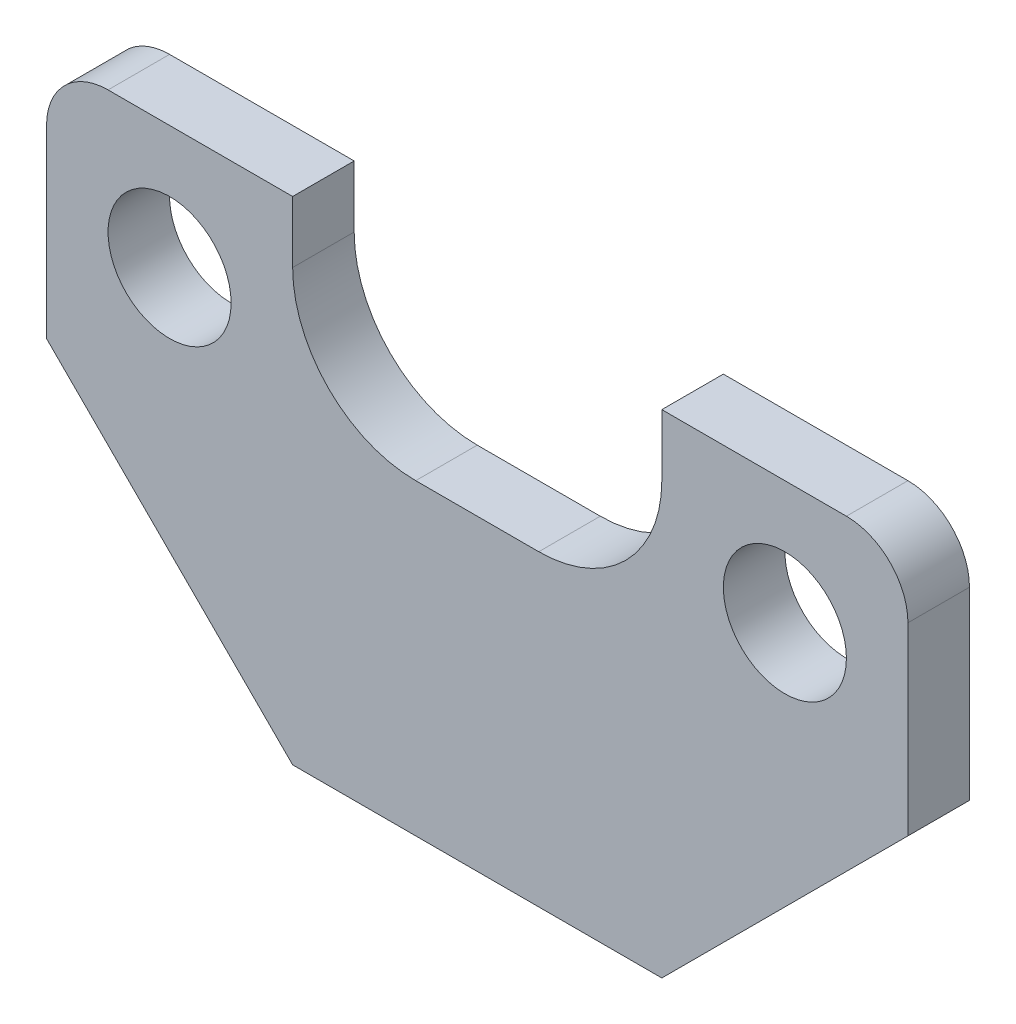
ISO-10303-21;
HEADER;
FILE_DESCRIPTION(('STEP AP214'),'2;1');
FILE_NAME('part.step','',(''),(''),'','','');
FILE_SCHEMA(('AUTOMOTIVE_DESIGN { 1 0 10303 214 1 1 1 1 }'));
ENDSEC;
DATA;
#1=APPLICATION_CONTEXT('core data for automotive mechanical design processes');
#2=APPLICATION_PROTOCOL_DEFINITION('international standard','automotive_design',2000,#1);
#3=PRODUCT_CONTEXT('',#1,'mechanical');
#4=PRODUCT('Part','Part','',(#3));
#5=PRODUCT_RELATED_PRODUCT_CATEGORY('part','',(#4));
#6=PRODUCT_DEFINITION_FORMATION('','',#4);
#7=PRODUCT_DEFINITION_CONTEXT('part definition',#1,'design');
#8=PRODUCT_DEFINITION('design','',#6,#7);
#9=PRODUCT_DEFINITION_SHAPE('','',#8);
#10=(LENGTH_UNIT() NAMED_UNIT(*) SI_UNIT(.MILLI.,.METRE.));
#11=(NAMED_UNIT(*) PLANE_ANGLE_UNIT() SI_UNIT($,.RADIAN.));
#12=(NAMED_UNIT(*) SI_UNIT($,.STERADIAN.) SOLID_ANGLE_UNIT());
#13=UNCERTAINTY_MEASURE_WITH_UNIT(LENGTH_MEASURE(1.E-05),#10,'distance_accuracy_value','');
#14=(GEOMETRIC_REPRESENTATION_CONTEXT(3) GLOBAL_UNCERTAINTY_ASSIGNED_CONTEXT((#13)) GLOBAL_UNIT_ASSIGNED_CONTEXT((#10,
#11,#12)) REPRESENTATION_CONTEXT('',''));
#15=CARTESIAN_POINT('',(0.,0.,0.));
#16=DIRECTION('',(0.,0.,1.));
#17=DIRECTION('',(1.,0.,0.));
#18=AXIS2_PLACEMENT_3D('',#15,#16,#17);
#19=CARTESIAN_POINT('',(6.00237949679068,11.8729903536978,5.));
#20=DIRECTION('',(0.,0.,1.));
#21=DIRECTION('',(1.,0.,0.));
#22=AXIS2_PLACEMENT_3D('',#19,#20,#21);
#23=PLANE('',#22);
#24=CARTESIAN_POINT('',(-23.9976205032093,6.87299035369775,5.));
#25=DIRECTION('',(0.,0.,1.));
#26=DIRECTION('',(1.,0.,0.));
#27=AXIS2_PLACEMENT_3D('',#24,#25,#26);
#28=CIRCLE('',#27,5.);
#29=CARTESIAN_POINT('',(-18.9976205032093,6.87299035369775,5.));
#30=VERTEX_POINT('',#29);
#31=EDGE_CURVE('E174',#30,#30,#28,.T.);
#32=ORIENTED_EDGE('',*,*,#31,.F.);
#33=EDGE_LOOP('',(#32));
#34=FACE_BOUND('',#33,.T.);
#35=CARTESIAN_POINT('',(6.00237949679068,11.8729903536978,5.));
#36=DIRECTION('',(0.,0.,-1.));
#37=DIRECTION('',(1.,0.,0.));
#38=AXIS2_PLACEMENT_3D('',#35,#36,#37);
#39=CIRCLE('',#38,10.);
#40=CARTESIAN_POINT('',(16.0023794967907,11.8729903536978,5.));
#41=VERTEX_POINT('',#40);
#42=CARTESIAN_POINT('',(6.00237949679068,1.87299035369776,5.));
#43=VERTEX_POINT('',#42);
#44=EDGE_CURVE('E197',#41,#43,#39,.T.);
#45=ORIENTED_EDGE('',*,*,#44,.T.);
#46=DIRECTION('',(-1.,0.,0.));
#47=VECTOR('',#46,1.);
#48=CARTESIAN_POINT('',(-3.99762050320931,1.87299035369776,5.));
#49=LINE('',#48,#47);
#50=CARTESIAN_POINT('',(-3.99762050320931,1.87299035369776,5.));
#51=VERTEX_POINT('',#50);
#52=EDGE_CURVE('E115',#43,#51,#49,.T.);
#53=ORIENTED_EDGE('',*,*,#52,.T.);
#54=CARTESIAN_POINT('',(-3.99762050320931,11.8729903536978,5.));
#55=DIRECTION('',(0.,0.,-1.));
#56=DIRECTION('',(1.,0.,0.));
#57=AXIS2_PLACEMENT_3D('',#54,#55,#56);
#58=CIRCLE('',#57,10.);
#59=CARTESIAN_POINT('',(-13.9976205032093,11.8729903536978,5.));
#60=VERTEX_POINT('',#59);
#61=EDGE_CURVE('E230',#51,#60,#58,.T.);
#62=ORIENTED_EDGE('',*,*,#61,.T.);
#63=DIRECTION('',(0.,1.,0.));
#64=VECTOR('',#63,1.);
#65=CARTESIAN_POINT('',(-13.9976205032093,16.8729903536978,5.));
#66=LINE('',#65,#64);
#67=CARTESIAN_POINT('',(-13.9976205032093,16.8729903536978,5.));
#68=VERTEX_POINT('',#67);
#69=EDGE_CURVE('E249',#60,#68,#66,.T.);
#70=ORIENTED_EDGE('',*,*,#69,.T.);
#71=DIRECTION('',(-1.,0.,0.));
#72=VECTOR('',#71,1.);
#73=CARTESIAN_POINT('',(-28.9976205032093,16.8729903536978,5.));
#74=LINE('',#73,#72);
#75=CARTESIAN_POINT('',(-28.9976205032093,16.8729903536978,5.));
#76=VERTEX_POINT('',#75);
#77=EDGE_CURVE('E246',#68,#76,#74,.T.);
#78=ORIENTED_EDGE('',*,*,#77,.T.);
#79=CARTESIAN_POINT('',(-28.9976205032093,11.8729903536978,5.));
#80=DIRECTION('',(0.,0.,1.));
#81=DIRECTION('',(1.,0.,0.));
#82=AXIS2_PLACEMENT_3D('',#79,#80,#81);
#83=CIRCLE('',#82,5.);
#84=CARTESIAN_POINT('',(-33.9976205032093,11.8729903536978,5.));
#85=VERTEX_POINT('',#84);
#86=EDGE_CURVE('E248',#76,#85,#83,.T.);
#87=ORIENTED_EDGE('',*,*,#86,.T.);
#88=DIRECTION('',(0.,-1.,0.));
#89=VECTOR('',#88,1.);
#90=CARTESIAN_POINT('',(-33.9976205032093,11.8729903536978,5.));
#91=LINE('',#90,#89);
#92=CARTESIAN_POINT('',(-33.9976205032093,-3.12700964630224,5.));
#93=VERTEX_POINT('',#92);
#94=EDGE_CURVE('E251',#85,#93,#91,.T.);
#95=ORIENTED_EDGE('',*,*,#94,.T.);
#96=DIRECTION('',(0.707106781186548,-0.707106781186548,0.));
#97=VECTOR('',#96,1.);
#98=CARTESIAN_POINT('',(-33.9976205032093,-3.12700964630224,5.));
#99=LINE('',#98,#97);
#100=CARTESIAN_POINT('',(-13.9976205032093,-23.1270096463022,5.));
#101=VERTEX_POINT('',#100);
#102=EDGE_CURVE('E257',#93,#101,#99,.T.);
#103=ORIENTED_EDGE('',*,*,#102,.T.);
#104=DIRECTION('',(1.,0.,0.));
#105=VECTOR('',#104,1.);
#106=CARTESIAN_POINT('',(-13.9976205032093,-23.1270096463022,5.));
#107=LINE('',#106,#105);
#108=CARTESIAN_POINT('',(16.0023794967907,-23.1270096463022,5.));
#109=VERTEX_POINT('',#108);
#110=EDGE_CURVE('E259',#101,#109,#107,.T.);
#111=ORIENTED_EDGE('',*,*,#110,.T.);
#112=DIRECTION('',(0.707106781186548,0.707106781186548,0.));
#113=VECTOR('',#112,1.);
#114=CARTESIAN_POINT('',(16.0023794967907,-23.1270096463022,5.));
#115=LINE('',#114,#113);
#116=CARTESIAN_POINT('',(36.0023794967907,-3.12700964630224,5.));
#117=VERTEX_POINT('',#116);
#118=EDGE_CURVE('E261',#109,#117,#115,.T.);
#119=ORIENTED_EDGE('',*,*,#118,.T.);
#120=DIRECTION('',(0.,1.,0.));
#121=VECTOR('',#120,1.);
#122=CARTESIAN_POINT('',(36.0023794967907,11.8729903536978,5.));
#123=LINE('',#122,#121);
#124=CARTESIAN_POINT('',(36.0023794967907,11.8729903536978,5.));
#125=VERTEX_POINT('',#124);
#126=EDGE_CURVE('E152',#117,#125,#123,.T.);
#127=ORIENTED_EDGE('',*,*,#126,.T.);
#128=CARTESIAN_POINT('',(31.0023794967907,11.8729903536978,5.));
#129=DIRECTION('',(0.,0.,1.));
#130=DIRECTION('',(-1.,0.,0.));
#131=AXIS2_PLACEMENT_3D('',#128,#129,#130);
#132=CIRCLE('',#131,5.);
#133=CARTESIAN_POINT('',(31.0023794967907,16.8729903536978,5.));
#134=VERTEX_POINT('',#133);
#135=EDGE_CURVE('E146',#125,#134,#132,.T.);
#136=ORIENTED_EDGE('',*,*,#135,.T.);
#137=DIRECTION('',(-1.,0.,0.));
#138=VECTOR('',#137,1.);
#139=CARTESIAN_POINT('',(16.0023794967907,16.8729903536978,5.));
#140=LINE('',#139,#138);
#141=CARTESIAN_POINT('',(16.0023794967907,16.8729903536978,5.));
#142=VERTEX_POINT('',#141);
#143=EDGE_CURVE('E150',#134,#142,#140,.T.);
#144=ORIENTED_EDGE('',*,*,#143,.T.);
#145=DIRECTION('',(0.,-1.,0.));
#146=VECTOR('',#145,1.);
#147=CARTESIAN_POINT('',(16.0023794967907,16.8729903536978,5.));
#148=LINE('',#147,#146);
#149=EDGE_CURVE('E54',#142,#41,#148,.T.);
#150=ORIENTED_EDGE('',*,*,#149,.T.);
#151=EDGE_LOOP('',(#45,#53,#62,#70,#78,#87,#95,#103,#111,#119,#127,#136,#144,#150));
#152=FACE_BOUND('',#151,.T.);
#153=CARTESIAN_POINT('',(26.0023794967907,6.87299035369775,5.));
#154=DIRECTION('',(0.,0.,1.));
#155=DIRECTION('',(1.,0.,0.));
#156=AXIS2_PLACEMENT_3D('',#153,#154,#155);
#157=CIRCLE('',#156,4.99999999999999);
#158=CARTESIAN_POINT('',(31.0023794967907,6.87299035369775,5.));
#159=VERTEX_POINT('',#158);
#160=EDGE_CURVE('E303',#159,#159,#157,.T.);
#161=ORIENTED_EDGE('',*,*,#160,.F.);
#162=EDGE_LOOP('',(#161));
#163=FACE_BOUND('',#162,.T.);
#164=ADVANCED_FACE('F37',(#34,#152,#163),#23,.T.);
#165=CARTESIAN_POINT('',(6.00237949679068,11.8729903536978,0.));
#166=DIRECTION('',(0.,0.,1.));
#167=DIRECTION('',(1.,0.,0.));
#168=AXIS2_PLACEMENT_3D('',#165,#166,#167);
#169=PLANE('',#168);
#170=CARTESIAN_POINT('',(6.00237949679068,11.8729903536978,0.));
#171=DIRECTION('',(0.,0.,-1.));
#172=DIRECTION('',(1.,0.,0.));
#173=AXIS2_PLACEMENT_3D('',#170,#171,#172);
#174=CIRCLE('',#173,10.);
#175=CARTESIAN_POINT('',(16.0023794967907,11.8729903536978,0.));
#176=VERTEX_POINT('',#175);
#177=CARTESIAN_POINT('',(6.00237949679068,1.87299035369776,0.));
#178=VERTEX_POINT('',#177);
#179=EDGE_CURVE('E170',#176,#178,#174,.T.);
#180=ORIENTED_EDGE('',*,*,#179,.F.);
#181=DIRECTION('',(0.,-1.,0.));
#182=VECTOR('',#181,1.);
#183=CARTESIAN_POINT('',(16.0023794967907,16.8729903536978,0.));
#184=LINE('',#183,#182);
#185=CARTESIAN_POINT('',(16.0023794967907,16.8729903536978,0.));
#186=VERTEX_POINT('',#185);
#187=EDGE_CURVE('E107',#186,#176,#184,.T.);
#188=ORIENTED_EDGE('',*,*,#187,.F.);
#189=DIRECTION('',(-1.,0.,0.));
#190=VECTOR('',#189,1.);
#191=CARTESIAN_POINT('',(16.0023794967907,16.8729903536978,0.));
#192=LINE('',#191,#190);
#193=CARTESIAN_POINT('',(31.0023794967907,16.8729903536978,0.));
#194=VERTEX_POINT('',#193);
#195=EDGE_CURVE('E101',#194,#186,#192,.T.);
#196=ORIENTED_EDGE('',*,*,#195,.F.);
#197=CARTESIAN_POINT('',(31.0023794967907,11.8729903536978,0.));
#198=DIRECTION('',(0.,0.,1.));
#199=DIRECTION('',(-1.,0.,0.));
#200=AXIS2_PLACEMENT_3D('',#197,#198,#199);
#201=CIRCLE('',#200,5.);
#202=CARTESIAN_POINT('',(36.0023794967907,11.8729903536978,0.));
#203=VERTEX_POINT('',#202);
#204=EDGE_CURVE('E160',#203,#194,#201,.T.);
#205=ORIENTED_EDGE('',*,*,#204,.F.);
#206=DIRECTION('',(0.,1.,0.));
#207=VECTOR('',#206,1.);
#208=CARTESIAN_POINT('',(36.0023794967907,11.8729903536978,0.));
#209=LINE('',#208,#207);
#210=CARTESIAN_POINT('',(36.0023794967907,-3.12700964630224,0.));
#211=VERTEX_POINT('',#210);
#212=EDGE_CURVE('E192',#211,#203,#209,.T.);
#213=ORIENTED_EDGE('',*,*,#212,.F.);
#214=DIRECTION('',(0.707106781186548,0.707106781186548,0.));
#215=VECTOR('',#214,1.);
#216=CARTESIAN_POINT('',(16.0023794967907,-23.1270096463022,0.));
#217=LINE('',#216,#215);
#218=CARTESIAN_POINT('',(16.0023794967907,-23.1270096463022,0.));
#219=VERTEX_POINT('',#218);
#220=EDGE_CURVE('E190',#219,#211,#217,.T.);
#221=ORIENTED_EDGE('',*,*,#220,.F.);
#222=DIRECTION('',(1.,0.,0.));
#223=VECTOR('',#222,1.);
#224=CARTESIAN_POINT('',(-13.9976205032093,-23.1270096463022,0.));
#225=LINE('',#224,#223);
#226=CARTESIAN_POINT('',(-13.9976205032093,-23.1270096463022,0.));
#227=VERTEX_POINT('',#226);
#228=EDGE_CURVE('E188',#227,#219,#225,.T.);
#229=ORIENTED_EDGE('',*,*,#228,.F.);
#230=DIRECTION('',(0.707106781186548,-0.707106781186548,0.));
#231=VECTOR('',#230,1.);
#232=CARTESIAN_POINT('',(-33.9976205032093,-3.12700964630224,0.));
#233=LINE('',#232,#231);
#234=CARTESIAN_POINT('',(-33.9976205032093,-3.12700964630224,0.));
#235=VERTEX_POINT('',#234);
#236=EDGE_CURVE('E186',#235,#227,#233,.T.);
#237=ORIENTED_EDGE('',*,*,#236,.F.);
#238=DIRECTION('',(0.,-1.,0.));
#239=VECTOR('',#238,1.);
#240=CARTESIAN_POINT('',(-33.9976205032093,11.8729903536978,0.));
#241=LINE('',#240,#239);
#242=CARTESIAN_POINT('',(-33.9976205032093,11.8729903536978,0.));
#243=VERTEX_POINT('',#242);
#244=EDGE_CURVE('E184',#243,#235,#241,.T.);
#245=ORIENTED_EDGE('',*,*,#244,.F.);
#246=CARTESIAN_POINT('',(-28.9976205032093,11.8729903536978,0.));
#247=DIRECTION('',(0.,0.,1.));
#248=DIRECTION('',(1.,0.,0.));
#249=AXIS2_PLACEMENT_3D('',#246,#247,#248);
#250=CIRCLE('',#249,5.);
#251=CARTESIAN_POINT('',(-28.9976205032093,16.8729903536978,0.));
#252=VERTEX_POINT('',#251);
#253=EDGE_CURVE('E182',#252,#243,#250,.T.);
#254=ORIENTED_EDGE('',*,*,#253,.F.);
#255=DIRECTION('',(-1.,0.,0.));
#256=VECTOR('',#255,1.);
#257=CARTESIAN_POINT('',(-28.9976205032093,16.8729903536978,0.));
#258=LINE('',#257,#256);
#259=CARTESIAN_POINT('',(-13.9976205032093,16.8729903536978,0.));
#260=VERTEX_POINT('',#259);
#261=EDGE_CURVE('E180',#260,#252,#258,.T.);
#262=ORIENTED_EDGE('',*,*,#261,.F.);
#263=DIRECTION('',(0.,1.,0.));
#264=VECTOR('',#263,1.);
#265=CARTESIAN_POINT('',(-13.9976205032093,16.8729903536978,0.));
#266=LINE('',#265,#264);
#267=CARTESIAN_POINT('',(-13.9976205032093,11.8729903536978,0.));
#268=VERTEX_POINT('',#267);
#269=EDGE_CURVE('E178',#268,#260,#266,.T.);
#270=ORIENTED_EDGE('',*,*,#269,.F.);
#271=CARTESIAN_POINT('',(-3.99762050320931,11.8729903536978,0.));
#272=DIRECTION('',(0.,0.,-1.));
#273=DIRECTION('',(1.,0.,0.));
#274=AXIS2_PLACEMENT_3D('',#271,#272,#273);
#275=CIRCLE('',#274,10.);
#276=CARTESIAN_POINT('',(-3.99762050320931,1.87299035369776,0.));
#277=VERTEX_POINT('',#276);
#278=EDGE_CURVE('E176',#277,#268,#275,.T.);
#279=ORIENTED_EDGE('',*,*,#278,.F.);
#280=DIRECTION('',(-1.,0.,0.));
#281=VECTOR('',#280,1.);
#282=CARTESIAN_POINT('',(-3.99762050320931,1.87299035369776,0.));
#283=LINE('',#282,#281);
#284=EDGE_CURVE('E173',#178,#277,#283,.T.);
#285=ORIENTED_EDGE('',*,*,#284,.F.);
#286=EDGE_LOOP('',(#180,#188,#196,#205,#213,#221,#229,#237,#245,#254,#262,#270,#279,#285));
#287=FACE_BOUND('',#286,.T.);
#288=CARTESIAN_POINT('',(-23.9976205032093,6.87299035369775,0.));
#289=DIRECTION('',(0.,0.,1.));
#290=DIRECTION('',(1.,0.,0.));
#291=AXIS2_PLACEMENT_3D('',#288,#289,#290);
#292=CIRCLE('',#291,5.);
#293=CARTESIAN_POINT('',(-18.9976205032093,6.87299035369775,0.));
#294=VERTEX_POINT('',#293);
#295=EDGE_CURVE('E309',#294,#294,#292,.T.);
#296=ORIENTED_EDGE('',*,*,#295,.T.);
#297=EDGE_LOOP('',(#296));
#298=FACE_BOUND('',#297,.T.);
#299=CARTESIAN_POINT('',(26.0023794967907,6.87299035369775,0.));
#300=DIRECTION('',(0.,0.,1.));
#301=DIRECTION('',(1.,0.,0.));
#302=AXIS2_PLACEMENT_3D('',#299,#300,#301);
#303=CIRCLE('',#302,4.99999999999999);
#304=CARTESIAN_POINT('',(31.0023794967907,6.87299035369775,0.));
#305=VERTEX_POINT('',#304);
#306=EDGE_CURVE('E306',#305,#305,#303,.T.);
#307=ORIENTED_EDGE('',*,*,#306,.T.);
#308=EDGE_LOOP('',(#307));
#309=FACE_BOUND('',#308,.T.);
#310=ADVANCED_FACE('F234',(#287,#298,#309),#169,.F.);
#311=CARTESIAN_POINT('',(6.00237949679068,11.8729903536978,5.));
#312=DIRECTION('',(0.,0.,-1.));
#313=DIRECTION('',(-1.,0.,0.));
#314=AXIS2_PLACEMENT_3D('',#311,#312,#313);
#315=CYLINDRICAL_SURFACE('',#314,10.);
#316=ORIENTED_EDGE('',*,*,#179,.T.);
#317=DIRECTION('',(0.,0.,-1.));
#318=VECTOR('',#317,1.);
#319=CARTESIAN_POINT('',(6.00237949679068,1.87299035369776,5.));
#320=LINE('',#319,#318);
#321=EDGE_CURVE('E11',#43,#178,#320,.T.);
#322=ORIENTED_EDGE('',*,*,#321,.F.);
#323=ORIENTED_EDGE('',*,*,#44,.F.);
#324=DIRECTION('',(0.,0.,-1.));
#325=VECTOR('',#324,1.);
#326=CARTESIAN_POINT('',(16.0023794967907,11.8729903536978,5.));
#327=LINE('',#326,#325);
#328=EDGE_CURVE('E166',#41,#176,#327,.T.);
#329=ORIENTED_EDGE('',*,*,#328,.T.);
#330=EDGE_LOOP('',(#316,#322,#323,#329));
#331=FACE_BOUND('',#330,.T.);
#332=ADVANCED_FACE('F39',(#331),#315,.F.);
#333=CARTESIAN_POINT('',(-3.99762050320931,1.87299035369776,5.));
#334=DIRECTION('',(0.,-1.,0.));
#335=DIRECTION('',(0.,0.,-1.));
#336=AXIS2_PLACEMENT_3D('',#333,#334,#335);
#337=PLANE('',#336);
#338=ORIENTED_EDGE('',*,*,#284,.T.);
#339=DIRECTION('',(0.,0.,-1.));
#340=VECTOR('',#339,1.);
#341=CARTESIAN_POINT('',(-3.99762050320931,1.87299035369776,5.));
#342=LINE('',#341,#340);
#343=EDGE_CURVE('E46',#51,#277,#342,.T.);
#344=ORIENTED_EDGE('',*,*,#343,.F.);
#345=ORIENTED_EDGE('',*,*,#52,.F.);
#346=ORIENTED_EDGE('',*,*,#321,.T.);
#347=EDGE_LOOP('',(#338,#344,#345,#346));
#348=FACE_BOUND('',#347,.T.);
#349=ADVANCED_FACE('F422',(#348),#337,.F.);
#350=CARTESIAN_POINT('',(-3.99762050320931,11.8729903536978,5.));
#351=DIRECTION('',(0.,0.,-1.));
#352=DIRECTION('',(-1.,0.,0.));
#353=AXIS2_PLACEMENT_3D('',#350,#351,#352);
#354=CYLINDRICAL_SURFACE('',#353,10.);
#355=ORIENTED_EDGE('',*,*,#278,.T.);
#356=DIRECTION('',(0.,0.,-1.));
#357=VECTOR('',#356,1.);
#358=CARTESIAN_POINT('',(-13.9976205032093,11.8729903536978,5.));
#359=LINE('',#358,#357);
#360=EDGE_CURVE('E222',#60,#268,#359,.T.);
#361=ORIENTED_EDGE('',*,*,#360,.F.);
#362=ORIENTED_EDGE('',*,*,#61,.F.);
#363=ORIENTED_EDGE('',*,*,#343,.T.);
#364=EDGE_LOOP('',(#355,#361,#362,#363));
#365=FACE_BOUND('',#364,.T.);
#366=ADVANCED_FACE('F228',(#365),#354,.F.);
#367=CARTESIAN_POINT('',(-13.9976205032093,16.8729903536978,5.));
#368=DIRECTION('',(-1.,0.,0.));
#369=DIRECTION('',(0.,-1.,0.));
#370=AXIS2_PLACEMENT_3D('',#367,#368,#369);
#371=PLANE('',#370);
#372=ORIENTED_EDGE('',*,*,#269,.T.);
#373=DIRECTION('',(0.,0.,-1.));
#374=VECTOR('',#373,1.);
#375=CARTESIAN_POINT('',(-13.9976205032093,16.8729903536978,5.));
#376=LINE('',#375,#374);
#377=EDGE_CURVE('E219',#68,#260,#376,.T.);
#378=ORIENTED_EDGE('',*,*,#377,.F.);
#379=ORIENTED_EDGE('',*,*,#69,.F.);
#380=ORIENTED_EDGE('',*,*,#360,.T.);
#381=EDGE_LOOP('',(#372,#378,#379,#380));
#382=FACE_BOUND('',#381,.T.);
#383=ADVANCED_FACE('F240',(#382),#371,.F.);
#384=CARTESIAN_POINT('',(-28.9976205032093,16.8729903536978,5.));
#385=DIRECTION('',(0.,-1.,0.));
#386=DIRECTION('',(0.,0.,-1.));
#387=AXIS2_PLACEMENT_3D('',#384,#385,#386);
#388=PLANE('',#387);
#389=ORIENTED_EDGE('',*,*,#261,.T.);
#390=DIRECTION('',(0.,0.,-1.));
#391=VECTOR('',#390,1.);
#392=CARTESIAN_POINT('',(-28.9976205032093,16.8729903536978,5.));
#393=LINE('',#392,#391);
#394=EDGE_CURVE('E216',#76,#252,#393,.T.);
#395=ORIENTED_EDGE('',*,*,#394,.F.);
#396=ORIENTED_EDGE('',*,*,#77,.F.);
#397=ORIENTED_EDGE('',*,*,#377,.T.);
#398=EDGE_LOOP('',(#389,#395,#396,#397));
#399=FACE_BOUND('',#398,.T.);
#400=ADVANCED_FACE('F244',(#399),#388,.F.);
#401=CARTESIAN_POINT('',(-28.9976205032093,11.8729903536978,5.));
#402=DIRECTION('',(0.,0.,-1.));
#403=DIRECTION('',(-1.,0.,0.));
#404=AXIS2_PLACEMENT_3D('',#401,#402,#403);
#405=CYLINDRICAL_SURFACE('',#404,5.);
#406=ORIENTED_EDGE('',*,*,#253,.T.);
#407=DIRECTION('',(0.,0.,-1.));
#408=VECTOR('',#407,1.);
#409=CARTESIAN_POINT('',(-33.9976205032093,11.8729903536978,5.));
#410=LINE('',#409,#408);
#411=EDGE_CURVE('E213',#85,#243,#410,.T.);
#412=ORIENTED_EDGE('',*,*,#411,.F.);
#413=ORIENTED_EDGE('',*,*,#86,.F.);
#414=ORIENTED_EDGE('',*,*,#394,.T.);
#415=EDGE_LOOP('',(#406,#412,#413,#414));
#416=FACE_BOUND('',#415,.T.);
#417=ADVANCED_FACE('F387',(#416),#405,.T.);
#418=CARTESIAN_POINT('',(-33.9976205032093,11.8729903536978,5.));
#419=DIRECTION('',(1.,0.,0.));
#420=DIRECTION('',(0.,0.,-1.));
#421=AXIS2_PLACEMENT_3D('',#418,#419,#420);
#422=PLANE('',#421);
#423=ORIENTED_EDGE('',*,*,#244,.T.);
#424=DIRECTION('',(0.,0.,-1.));
#425=VECTOR('',#424,1.);
#426=CARTESIAN_POINT('',(-33.9976205032093,-3.12700964630224,5.));
#427=LINE('',#426,#425);
#428=EDGE_CURVE('E210',#93,#235,#427,.T.);
#429=ORIENTED_EDGE('',*,*,#428,.F.);
#430=ORIENTED_EDGE('',*,*,#94,.F.);
#431=ORIENTED_EDGE('',*,*,#411,.T.);
#432=EDGE_LOOP('',(#423,#429,#430,#431));
#433=FACE_BOUND('',#432,.T.);
#434=ADVANCED_FACE('F377',(#433),#422,.F.);
#435=CARTESIAN_POINT('',(-33.9976205032093,-3.12700964630224,5.));
#436=DIRECTION('',(0.707106781186548,0.707106781186548,0.));
#437=DIRECTION('',(-0.707106781186548,0.707106781186548,0.));
#438=AXIS2_PLACEMENT_3D('',#435,#436,#437);
#439=PLANE('',#438);
#440=ORIENTED_EDGE('',*,*,#236,.T.);
#441=DIRECTION('',(0.,0.,-1.));
#442=VECTOR('',#441,1.);
#443=CARTESIAN_POINT('',(-13.9976205032093,-23.1270096463022,5.));
#444=LINE('',#443,#442);
#445=EDGE_CURVE('E207',#101,#227,#444,.T.);
#446=ORIENTED_EDGE('',*,*,#445,.F.);
#447=ORIENTED_EDGE('',*,*,#102,.F.);
#448=ORIENTED_EDGE('',*,*,#428,.T.);
#449=EDGE_LOOP('',(#440,#446,#447,#448));
#450=FACE_BOUND('',#449,.T.);
#451=ADVANCED_FACE('F367',(#450),#439,.F.);
#452=CARTESIAN_POINT('',(-13.9976205032093,-23.1270096463022,5.));
#453=DIRECTION('',(0.,1.,0.));
#454=DIRECTION('',(0.,0.,1.));
#455=AXIS2_PLACEMENT_3D('',#452,#453,#454);
#456=PLANE('',#455);
#457=ORIENTED_EDGE('',*,*,#228,.T.);
#458=DIRECTION('',(0.,0.,-1.));
#459=VECTOR('',#458,1.);
#460=CARTESIAN_POINT('',(16.0023794967907,-23.1270096463022,5.));
#461=LINE('',#460,#459);
#462=EDGE_CURVE('E204',#109,#219,#461,.T.);
#463=ORIENTED_EDGE('',*,*,#462,.F.);
#464=ORIENTED_EDGE('',*,*,#110,.F.);
#465=ORIENTED_EDGE('',*,*,#445,.T.);
#466=EDGE_LOOP('',(#457,#463,#464,#465));
#467=FACE_BOUND('',#466,.T.);
#468=ADVANCED_FACE('F358',(#467),#456,.F.);
#469=CARTESIAN_POINT('',(16.0023794967907,-23.1270096463022,5.));
#470=DIRECTION('',(-0.707106781186548,0.707106781186548,0.));
#471=DIRECTION('',(-0.707106781186548,-0.707106781186548,0.));
#472=AXIS2_PLACEMENT_3D('',#469,#470,#471);
#473=PLANE('',#472);
#474=ORIENTED_EDGE('',*,*,#220,.T.);
#475=DIRECTION('',(0.,0.,-1.));
#476=VECTOR('',#475,1.);
#477=CARTESIAN_POINT('',(36.0023794967907,-3.12700964630224,5.));
#478=LINE('',#477,#476);
#479=EDGE_CURVE('E201',#117,#211,#478,.T.);
#480=ORIENTED_EDGE('',*,*,#479,.F.);
#481=ORIENTED_EDGE('',*,*,#118,.F.);
#482=ORIENTED_EDGE('',*,*,#462,.T.);
#483=EDGE_LOOP('',(#474,#480,#481,#482));
#484=FACE_BOUND('',#483,.T.);
#485=ADVANCED_FACE('F267',(#484),#473,.F.);
#486=CARTESIAN_POINT('',(36.0023794967907,11.8729903536978,5.));
#487=DIRECTION('',(-1.,0.,0.));
#488=DIRECTION('',(0.,-1.,0.));
#489=AXIS2_PLACEMENT_3D('',#486,#487,#488);
#490=PLANE('',#489);
#491=ORIENTED_EDGE('',*,*,#212,.T.);
#492=DIRECTION('',(0.,0.,-1.));
#493=VECTOR('',#492,1.);
#494=CARTESIAN_POINT('',(36.0023794967907,11.8729903536978,5.));
#495=LINE('',#494,#493);
#496=EDGE_CURVE('E161',#125,#203,#495,.T.);
#497=ORIENTED_EDGE('',*,*,#496,.F.);
#498=ORIENTED_EDGE('',*,*,#126,.F.);
#499=ORIENTED_EDGE('',*,*,#479,.T.);
#500=EDGE_LOOP('',(#491,#497,#498,#499));
#501=FACE_BOUND('',#500,.T.);
#502=ADVANCED_FACE('F271',(#501),#490,.F.);
#503=CARTESIAN_POINT('',(31.0023794967907,11.8729903536978,5.));
#504=DIRECTION('',(0.,0.,-1.));
#505=DIRECTION('',(-1.,0.,0.));
#506=AXIS2_PLACEMENT_3D('',#503,#504,#505);
#507=CYLINDRICAL_SURFACE('',#506,5.);
#508=ORIENTED_EDGE('',*,*,#204,.T.);
#509=DIRECTION('',(0.,0.,-1.));
#510=VECTOR('',#509,1.);
#511=CARTESIAN_POINT('',(31.0023794967907,16.8729903536978,5.));
#512=LINE('',#511,#510);
#513=EDGE_CURVE('E157',#134,#194,#512,.T.);
#514=ORIENTED_EDGE('',*,*,#513,.F.);
#515=ORIENTED_EDGE('',*,*,#135,.F.);
#516=ORIENTED_EDGE('',*,*,#496,.T.);
#517=EDGE_LOOP('',(#508,#514,#515,#516));
#518=FACE_BOUND('',#517,.T.);
#519=ADVANCED_FACE('F158',(#518),#507,.T.);
#520=CARTESIAN_POINT('',(16.0023794967907,16.8729903536978,5.));
#521=DIRECTION('',(0.,-1.,0.));
#522=DIRECTION('',(0.,0.,-1.));
#523=AXIS2_PLACEMENT_3D('',#520,#521,#522);
#524=PLANE('',#523);
#525=ORIENTED_EDGE('',*,*,#195,.T.);
#526=DIRECTION('',(0.,0.,-1.));
#527=VECTOR('',#526,1.);
#528=CARTESIAN_POINT('',(16.0023794967907,16.8729903536978,5.));
#529=LINE('',#528,#527);
#530=EDGE_CURVE('E162',#142,#186,#529,.T.);
#531=ORIENTED_EDGE('',*,*,#530,.F.);
#532=ORIENTED_EDGE('',*,*,#143,.F.);
#533=ORIENTED_EDGE('',*,*,#513,.T.);
#534=EDGE_LOOP('',(#525,#531,#532,#533));
#535=FACE_BOUND('',#534,.T.);
#536=ADVANCED_FACE('F164',(#535),#524,.F.);
#537=CARTESIAN_POINT('',(16.0023794967907,16.8729903536978,5.));
#538=DIRECTION('',(1.,0.,0.));
#539=DIRECTION('',(0.,0.,-1.));
#540=AXIS2_PLACEMENT_3D('',#537,#538,#539);
#541=PLANE('',#540);
#542=ORIENTED_EDGE('',*,*,#187,.T.);
#543=ORIENTED_EDGE('',*,*,#328,.F.);
#544=ORIENTED_EDGE('',*,*,#149,.F.);
#545=ORIENTED_EDGE('',*,*,#530,.T.);
#546=EDGE_LOOP('',(#542,#543,#544,#545));
#547=FACE_BOUND('',#546,.T.);
#548=ADVANCED_FACE('F275',(#547),#541,.F.);
#549=CARTESIAN_POINT('',(-23.9976205032093,6.87299035369775,5.));
#550=DIRECTION('',(0.,0.,-1.));
#551=DIRECTION('',(-1.,0.,0.));
#552=AXIS2_PLACEMENT_3D('',#549,#550,#551);
#553=CYLINDRICAL_SURFACE('',#552,5.);
#554=ORIENTED_EDGE('',*,*,#31,.T.);
#555=EDGE_LOOP('',(#554));
#556=FACE_BOUND('',#555,.T.);
#557=ORIENTED_EDGE('',*,*,#295,.F.);
#558=EDGE_LOOP('',(#557));
#559=FACE_BOUND('',#558,.T.);
#560=ADVANCED_FACE('F277',(#556,#559),#553,.F.);
#561=CARTESIAN_POINT('',(26.0023794967907,6.87299035369775,5.));
#562=DIRECTION('',(0.,0.,-1.));
#563=DIRECTION('',(-1.,0.,0.));
#564=AXIS2_PLACEMENT_3D('',#561,#562,#563);
#565=CYLINDRICAL_SURFACE('',#564,4.99999999999999);
#566=ORIENTED_EDGE('',*,*,#160,.T.);
#567=EDGE_LOOP('',(#566));
#568=FACE_BOUND('',#567,.T.);
#569=ORIENTED_EDGE('',*,*,#306,.F.);
#570=EDGE_LOOP('',(#569));
#571=FACE_BOUND('',#570,.T.);
#572=ADVANCED_FACE('F283',(#568,#571),#565,.F.);
#573=CLOSED_SHELL('',(#164,#310,#332,#349,#366,#383,#400,#417,#434,#451,#468,#485,#502,#519,
#536,#548,#560,#572));
#574=MANIFOLD_SOLID_BREP('B2',#573);
#575=ADVANCED_BREP_SHAPE_REPRESENTATION('',(#18,#574),#14);
#576=SHAPE_DEFINITION_REPRESENTATION(#9,#575);
ENDSEC;
END-ISO-10303-21;
